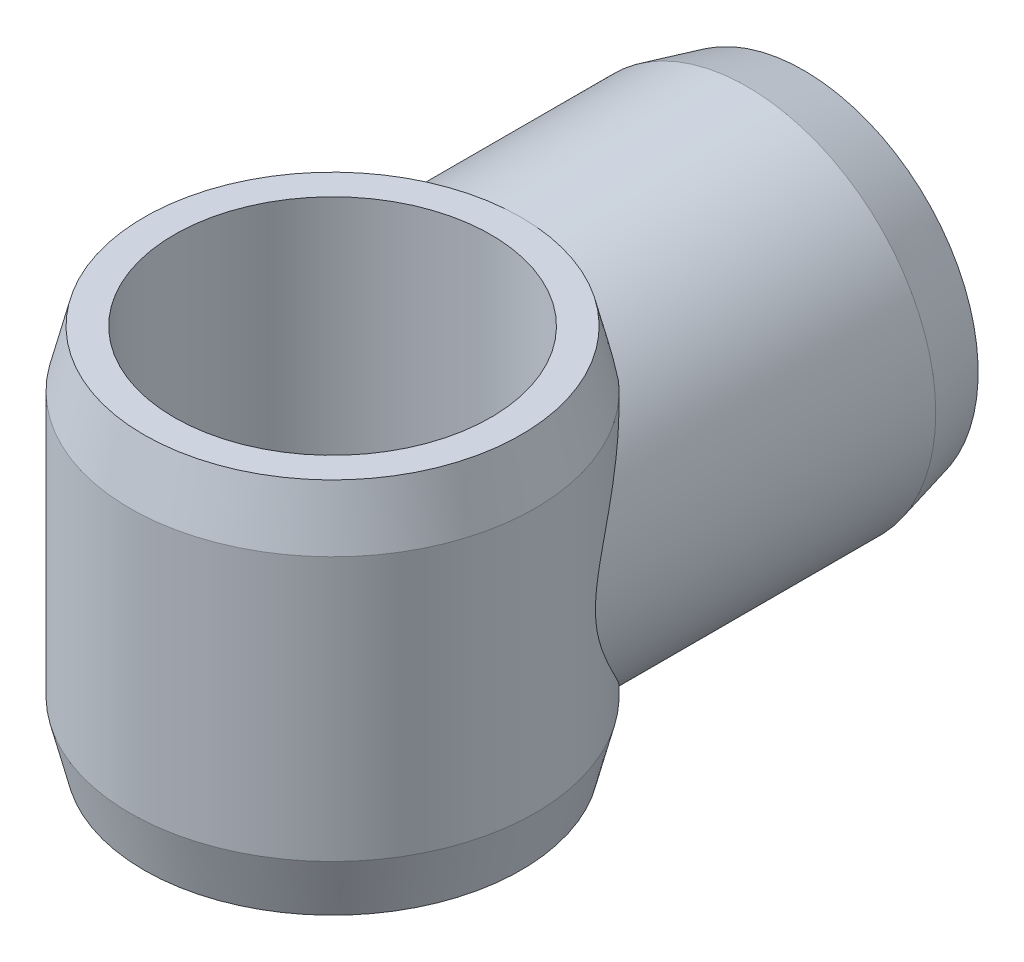
ISO-10303-21;
HEADER;
FILE_DESCRIPTION(('STEP AP214'),'2;1');
FILE_NAME('part.step','',(''),(''),'','','');
FILE_SCHEMA(('AUTOMOTIVE_DESIGN { 1 0 10303 214 1 1 1 1 }'));
ENDSEC;
DATA;
#1=APPLICATION_CONTEXT('core data for automotive mechanical design processes');
#2=APPLICATION_PROTOCOL_DEFINITION('international standard','automotive_design',2000,#1);
#3=PRODUCT_CONTEXT('',#1,'mechanical');
#4=PRODUCT('Part','Part','',(#3));
#5=PRODUCT_RELATED_PRODUCT_CATEGORY('part','',(#4));
#6=PRODUCT_DEFINITION_FORMATION('','',#4);
#7=PRODUCT_DEFINITION_CONTEXT('part definition',#1,'design');
#8=PRODUCT_DEFINITION('design','',#6,#7);
#9=PRODUCT_DEFINITION_SHAPE('','',#8);
#10=(LENGTH_UNIT() NAMED_UNIT(*) SI_UNIT(.MILLI.,.METRE.));
#11=(NAMED_UNIT(*) PLANE_ANGLE_UNIT() SI_UNIT($,.RADIAN.));
#12=(NAMED_UNIT(*) SI_UNIT($,.STERADIAN.) SOLID_ANGLE_UNIT());
#13=UNCERTAINTY_MEASURE_WITH_UNIT(LENGTH_MEASURE(1.E-05),#10,'distance_accuracy_value','');
#14=(GEOMETRIC_REPRESENTATION_CONTEXT(3) GLOBAL_UNCERTAINTY_ASSIGNED_CONTEXT((#13)) GLOBAL_UNIT_ASSIGNED_CONTEXT((#10,
#11,#12)) REPRESENTATION_CONTEXT('',''));
#15=CARTESIAN_POINT('',(0.,0.,0.));
#16=DIRECTION('',(0.,0.,1.));
#17=DIRECTION('',(1.,0.,0.));
#18=AXIS2_PLACEMENT_3D('',#15,#16,#17);
#19=CARTESIAN_POINT('',(0.,25.4,0.));
#20=DIRECTION('',(0.,-1.,0.));
#21=DIRECTION('',(0.,0.,-1.));
#22=AXIS2_PLACEMENT_3D('',#19,#20,#21);
#23=CYLINDRICAL_SURFACE('',#22,13.6525);
#24=CARTESIAN_POINT('',(-5.01006549359588,4.7487958301978,-12.6999999999953));
#25=CARTESIAN_POINT('',(-5.24885199323534,4.8992791694602,-12.605829803232));
#26=CARTESIAN_POINT('',(-5.47947450181361,5.05959839201906,-12.5070410206802));
#27=CARTESIAN_POINT('',(-5.92357781907762,5.39851371768995,-12.3029050310004));
#28=CARTESIAN_POINT('',(-6.13706722338515,5.57710055240605,-12.1975611602349));
#29=CARTESIAN_POINT('',(-6.54782736507222,5.95267705119812,-11.9821095982729));
#30=CARTESIAN_POINT('',(-6.74496829118243,6.14979157020008,-11.871972738598));
#31=CARTESIAN_POINT('',(-7.12072860066184,6.56036738615513,-11.6504734505019));
#32=CARTESIAN_POINT('',(-7.29934534202377,6.77383100736763,-11.5391108497583));
#33=CARTESIAN_POINT('',(-7.63723933399714,7.21617099704601,-11.3183050856353));
#34=CARTESIAN_POINT('',(-7.79653222705364,7.44503466282995,-11.2088604319389));
#35=CARTESIAN_POINT('',(-8.09513529466458,7.91780840010443,-10.9951466026978));
#36=CARTESIAN_POINT('',(-8.23444343792827,8.16171999749934,-10.8908779539561));
#37=CARTESIAN_POINT('',(-8.49150464776284,8.66318365069259,-10.6916540080425));
#38=CARTESIAN_POINT('',(-8.60932657618659,8.92068859268369,-10.5966694270231));
#39=CARTESIAN_POINT('',(-8.82244757209768,9.44917156901811,-10.4199020112688));
#40=CARTESIAN_POINT('',(-8.91775893928788,9.72014214734857,-10.3381119748542));
#41=CARTESIAN_POINT('',(-9.05752471874923,10.1855608405615,-10.2155603588938));
#42=CARTESIAN_POINT('',(-9.10850063724888,10.3768175304103,-10.1700369658767));
#43=CARTESIAN_POINT('',(-9.1985960880708,10.7640950667172,-10.0886212942419));
#44=CARTESIAN_POINT('',(-9.2377191042781,10.9601144949451,-10.0527261859703));
#45=CARTESIAN_POINT('',(-9.30350684455108,11.3556422589091,-9.99187321871044));
#46=CARTESIAN_POINT('',(-9.33018863612351,11.5551454231054,-9.96690037893289));
#47=CARTESIAN_POINT('',(-9.37072269098755,11.956593065493,-9.92880118080943));
#48=CARTESIAN_POINT('',(-9.38457475339085,12.158537581861,-9.91567500795908));
#49=CARTESIAN_POINT('',(-9.3992131070932,12.5640186454323,-9.90180057892744));
#50=CARTESIAN_POINT('',(-9.39995485008133,12.7675582704711,-9.90109452582644));
#51=CARTESIAN_POINT('',(-9.38824444587053,13.1739056854136,-9.9121987957247));
#52=CARTESIAN_POINT('',(-9.37579251078941,13.3767134870303,-9.92400891749853));
#53=CARTESIAN_POINT('',(-9.33791163611287,13.7802421617488,-9.95966031356682));
#54=CARTESIAN_POINT('',(-9.31246950769233,13.9809607018929,-9.98351381512042));
#55=CARTESIAN_POINT('',(-9.24903919179672,14.3787708413489,-10.0423050154206));
#56=CARTESIAN_POINT('',(-9.21104832128694,14.5758616554978,-10.0772450845129));
#57=CARTESIAN_POINT('',(-9.11427159236757,15.0043129905254,-10.1649340510647));
#58=CARTESIAN_POINT('',(-9.05284527714515,15.2346350921119,-10.2198478600754));
#59=CARTESIAN_POINT('',(-8.91377857385275,15.6871439161762,-10.3413644678315));
#60=CARTESIAN_POINT('',(-8.83613431320729,15.9093286806728,-10.4079700577722));
#61=CARTESIAN_POINT('',(-8.66549696650441,16.3450508452897,-10.5504632692385));
#62=CARTESIAN_POINT('',(-8.5724800355521,16.5585741593513,-10.6263652625118));
#63=CARTESIAN_POINT('',(-8.37206887302446,16.9760357442998,-10.7849702232836));
#64=CARTESIAN_POINT('',(-8.26467540967235,17.1799745265588,-10.8676728272942));
#65=CARTESIAN_POINT('',(-7.91725462624004,17.7851643405274,-11.1261866585939));
#66=CARTESIAN_POINT('',(-7.65545661199009,18.1710105562255,-11.3093695025267));
#67=CARTESIAN_POINT('',(-7.07938613679676,18.8983521397315,-11.6786150550954));
#68=CARTESIAN_POINT('',(-6.76519867375624,19.2399177791938,-11.8646726630284));
#69=CARTESIAN_POINT('',(-6.20985990624829,19.7602982493908,-12.1609427694005));
#70=CARTESIAN_POINT('',(-5.98347237547156,19.9532520522998,-12.2742178443135));
#71=CARTESIAN_POINT('',(-5.5112070368571,20.3182630432449,-12.4934096191945));
#72=CARTESIAN_POINT('',(-5.26533140350488,20.4903225572593,-12.599327137652));
#73=CARTESIAN_POINT('',(-5.01006549359588,20.6512041698022,-12.6999999999953));
#74=B_SPLINE_CURVE_WITH_KNOTS('',3,(#24,#25,#26,#27,#28,#29,#30,#31,#32,#33,#34,#35,#36,#37,#38,
#39,#40,#41,#42,#43,#44,#45,#46,#47,#48,#49,#50,#51,#52,#53,#54,#55,#56,#57,#58,#59,#60,#61,#62,
#63,#64,#65,#66,#67,#68,#69,#70,#71,#72,#73),.UNSPECIFIED.,.F.,.F.,(4,2,2,2,2,2,2,2,2,2,2,2,2,2,
2,2,2,2,2,2,2,2,2,2,4),(0.,0.892156097495962,1.78386176813339,2.68207864952074,3.58042346319741,
4.47803615406301,5.37574001557059,6.27051419652274,7.16479833859998,7.77354753842628,
8.38211763660095,8.98985039300644,9.59759266514956,10.2073996243222,10.817196779636,
11.4276142912441,12.0381624002177,12.7709395993384,13.503891973899,14.237992105572,
14.9720530255771,16.4696323118927,17.964805117869,18.9184303819013,19.8719493896704),.UNSPECIFIED.);
#75=CARTESIAN_POINT('',(-5.01006549358389,4.74879583019025,-12.6999999999953));
#76=VERTEX_POINT('',#75);
#77=CARTESIAN_POINT('',(-5.01006549358389,20.6512041698098,-12.6999999999953));
#78=VERTEX_POINT('',#77);
#79=EDGE_CURVE('E63',#76,#78,#74,.T.);
#80=ORIENTED_EDGE('',*,*,#79,.T.);
#81=DIRECTION('',(0.,-1.,0.));
#82=VECTOR('',#81,1.);
#83=CARTESIAN_POINT('',(-5.01006549358389,25.4,-12.7));
#84=LINE('',#83,#82);
#85=EDGE_CURVE('E66',#76,#78,#84,.F.);
#86=ORIENTED_EDGE('',*,*,#85,.F.);
#87=EDGE_LOOP('',(#80,#86));
#88=FACE_BOUND('',#87,.T.);
#89=ADVANCED_FACE('F44',(#88),#23,.T.);
#90=CARTESIAN_POINT('',(5.01006549359588,20.6512041698022,-12.6999999999953));
#91=CARTESIAN_POINT('',(5.24885199323535,20.5007208305398,-12.605829803232));
#92=CARTESIAN_POINT('',(5.47947450181361,20.3404016079809,-12.5070410206802));
#93=CARTESIAN_POINT('',(5.92357781907762,20.0014862823101,-12.3029050310004));
#94=CARTESIAN_POINT('',(6.13706722338515,19.822899447594,-12.1975611602349));
#95=CARTESIAN_POINT('',(6.54782736507222,19.4473229488019,-11.9821095982729));
#96=CARTESIAN_POINT('',(6.74496829118243,19.2502084297999,-11.871972738598));
#97=CARTESIAN_POINT('',(7.12072860066184,18.8396326138449,-11.6504734505019));
#98=CARTESIAN_POINT('',(7.29934534202377,18.6261689926324,-11.5391108497583));
#99=CARTESIAN_POINT('',(7.63723933399714,18.183829002954,-11.3183050856353));
#100=CARTESIAN_POINT('',(7.79653222705364,17.95496533717,-11.2088604319389));
#101=CARTESIAN_POINT('',(8.09513529466458,17.4821915998956,-10.9951466026978));
#102=CARTESIAN_POINT('',(8.23444343792828,17.2382800025007,-10.8908779539561));
#103=CARTESIAN_POINT('',(8.49150464776284,16.7368163493074,-10.6916540080425));
#104=CARTESIAN_POINT('',(8.6093265761866,16.4793114073163,-10.5966694270231));
#105=CARTESIAN_POINT('',(8.82244757209768,15.9508284309819,-10.4199020112688));
#106=CARTESIAN_POINT('',(8.91775893928788,15.6798578526514,-10.3381119748542));
#107=CARTESIAN_POINT('',(9.05752471874923,15.2144391594385,-10.2155603588938));
#108=CARTESIAN_POINT('',(9.10850063724888,15.0231824695897,-10.1700369658766));
#109=CARTESIAN_POINT('',(9.1985960880708,14.6359049332828,-10.0886212942419));
#110=CARTESIAN_POINT('',(9.2377191042781,14.4398855050549,-10.0527261859703));
#111=CARTESIAN_POINT('',(9.30350684455108,14.0443577410909,-9.99187321871045));
#112=CARTESIAN_POINT('',(9.33018863612351,13.8448545768946,-9.96690037893289));
#113=CARTESIAN_POINT('',(9.37072269098755,13.443406934507,-9.92880118080942));
#114=CARTESIAN_POINT('',(9.38457475339085,13.241462418139,-9.91567500795908));
#115=CARTESIAN_POINT('',(9.3992131070932,12.8359813545677,-9.90180057892744));
#116=CARTESIAN_POINT('',(9.39995485008133,12.6324417295289,-9.90109452582643));
#117=CARTESIAN_POINT('',(9.38824444587053,12.2260943145864,-9.9121987957247));
#118=CARTESIAN_POINT('',(9.37579251078941,12.0232865129697,-9.92400891749853));
#119=CARTESIAN_POINT('',(9.33791163611287,11.6197578382512,-9.95966031356682));
#120=CARTESIAN_POINT('',(9.31246950769232,11.4190392981071,-9.98351381512042));
#121=CARTESIAN_POINT('',(9.24903919179672,11.0212291586511,-10.0423050154206));
#122=CARTESIAN_POINT('',(9.21104832128693,10.8241383445022,-10.0772450845129));
#123=CARTESIAN_POINT('',(9.11427159236757,10.3956870094746,-10.1649340510647));
#124=CARTESIAN_POINT('',(9.05284527714515,10.165364907888,-10.2198478600754));
#125=CARTESIAN_POINT('',(8.91377857385274,9.71285608382383,-10.3413644678315));
#126=CARTESIAN_POINT('',(8.83613431320729,9.49067131932715,-10.4079700577722));
#127=CARTESIAN_POINT('',(8.66549696650441,9.05494915471034,-10.5504632692385));
#128=CARTESIAN_POINT('',(8.57248003555209,8.84142584064867,-10.6263652625119));
#129=CARTESIAN_POINT('',(8.37206887302445,8.42396425570014,-10.7849702232836));
#130=CARTESIAN_POINT('',(8.26467540967235,8.22002547344119,-10.8676728272942));
#131=CARTESIAN_POINT('',(7.91725462624003,7.61483565947261,-11.1261866585939));
#132=CARTESIAN_POINT('',(7.65545661199008,7.22898944377452,-11.3093695025267));
#133=CARTESIAN_POINT('',(7.07938613679675,6.50164786026848,-11.6786150550954));
#134=CARTESIAN_POINT('',(6.76519867375623,6.16008222080617,-11.8646726630284));
#135=CARTESIAN_POINT('',(6.20985990624829,5.63970175060923,-12.1609427694005));
#136=CARTESIAN_POINT('',(5.98347237547156,5.4467479477002,-12.2742178443135));
#137=CARTESIAN_POINT('',(5.5112070368571,5.08173695675512,-12.4934096191945));
#138=CARTESIAN_POINT('',(5.26533140350488,4.90967744274068,-12.599327137652));
#139=CARTESIAN_POINT('',(5.01006549359588,4.7487958301978,-12.6999999999953));
#140=B_SPLINE_CURVE_WITH_KNOTS('',3,(#90,#91,#92,#93,#94,#95,#96,#97,#98,#99,#100,#101,#102,
#103,#104,#105,#106,#107,#108,#109,#110,#111,#112,#113,#114,#115,#116,#117,#118,#119,#120,#121,
#122,#123,#124,#125,#126,#127,#128,#129,#130,#131,#132,#133,#134,#135,#136,#137,#138,#139),
.UNSPECIFIED.,.F.,.F.,(4,2,2,2,2,2,2,2,2,2,2,2,2,2,2,2,2,2,2,2,2,2,2,2,4),(0.,0.892156097495961,
1.78386176813339,2.68207864952074,3.58042346319741,4.47803615406301,5.3757400155706,
6.27051419652275,7.16479833859998,7.77354753842628,8.38211763660095,8.98985039300644,
9.59759266514956,10.2073996243222,10.817196779636,11.4276142912441,12.0381624002177,
12.7709395993384,13.503891973899,14.237992105572,14.9720530255771,16.4696323118928,
17.964805117869,18.9184303819013,19.8719493896704),.UNSPECIFIED.);
#141=CARTESIAN_POINT('',(5.01006549358389,20.6512041698098,-12.6999999999953));
#142=VERTEX_POINT('',#141);
#143=CARTESIAN_POINT('',(5.01006549358389,4.74879583019025,-12.6999999999953));
#144=VERTEX_POINT('',#143);
#145=EDGE_CURVE('E185',#142,#144,#140,.T.);
#146=ORIENTED_EDGE('',*,*,#145,.T.);
#147=DIRECTION('',(0.,-1.,0.));
#148=VECTOR('',#147,1.);
#149=CARTESIAN_POINT('',(5.01006549358389,25.4,-12.7));
#150=LINE('',#149,#148);
#151=EDGE_CURVE('E176',#142,#144,#150,.T.);
#152=ORIENTED_EDGE('',*,*,#151,.F.);
#153=EDGE_LOOP('',(#146,#152));
#154=FACE_BOUND('',#153,.T.);
#155=ADVANCED_FACE('F46',(#154),#23,.T.);
#156=CARTESIAN_POINT('',(0.,12.7,500000.));
#157=DIRECTION('',(0.,0.,-1.));
#158=DIRECTION('',(-1.,0.,0.));
#159=AXIS2_PLACEMENT_3D('',#156,#157,#158);
#160=CYLINDRICAL_SURFACE('',#159,12.7);
#161=CARTESIAN_POINT('',(9.06961410424942,3.81,-10.2045507617925));
#162=CARTESIAN_POINT('',(9.2293478116452,3.97298093650903,-10.062585453037));
#163=CARTESIAN_POINT('',(9.38380381091571,4.1393247823001,-9.91859226235884));
#164=CARTESIAN_POINT('',(9.68228522227931,4.4784152695319,-9.62743736068499));
#165=CARTESIAN_POINT('',(9.82631220115903,4.65116094328481,-9.48027612996207));
#166=CARTESIAN_POINT('',(10.1043376377466,5.00307146442112,-9.18338433944754));
#167=CARTESIAN_POINT('',(10.2383191525511,5.18224643521794,-9.03364994016951));
#168=CARTESIAN_POINT('',(10.4961354502637,5.54661208472218,-8.7327626783487));
#169=CARTESIAN_POINT('',(10.6199699219714,5.73180294768834,-8.58160977245998));
#170=CARTESIAN_POINT('',(10.8589263100322,6.11028339058769,-8.27721717710624));
#171=CARTESIAN_POINT('',(10.9739361179237,6.30364009808886,-8.12397296357276));
#172=CARTESIAN_POINT('',(11.1937783683698,6.69666496779323,-7.81828093803262));
#173=CARTESIAN_POINT('',(11.2986109586318,6.8963330383405,-7.66583311449793));
#174=CARTESIAN_POINT('',(11.4980138650766,7.30215381882273,-7.36336918279845));
#175=CARTESIAN_POINT('',(11.5925946981217,7.50829959797344,-7.21335071949049));
#176=CARTESIAN_POINT('',(11.7715216474149,7.92786241625003,-6.91750532157284));
#177=CARTESIAN_POINT('',(11.8558703645903,8.14127758980979,-6.77167732899949));
#178=CARTESIAN_POINT('',(11.9907069800341,8.51198257965089,-6.52892713749255));
#179=CARTESIAN_POINT('',(12.0438299787696,8.66719825915444,-6.43029964511386));
#180=CARTESIAN_POINT('',(12.1447433434792,8.98212946913938,-6.23761043203769));
#181=CARTESIAN_POINT('',(12.1925341609901,9.14184461716246,-6.14354832511846));
#182=CARTESIAN_POINT('',(12.2825450379461,9.46621175623357,-5.96155486384697));
#183=CARTESIAN_POINT('',(12.3247675794314,9.63086150725823,-5.87362078624527));
#184=CARTESIAN_POINT('',(12.4033223632629,9.96555616868532,-5.70586939393166));
#185=CARTESIAN_POINT('',(12.4396550493415,10.1356006715005,-5.62605146793075));
#186=CARTESIAN_POINT('',(12.5285577296923,10.5993646934798,-5.42629538905201));
#187=CARTESIAN_POINT('',(12.5753968528595,10.8986453896415,-5.31592555093723));
#188=CARTESIAN_POINT('',(12.6299012195096,11.3585970787951,-5.18446191317588));
#189=CARTESIAN_POINT('',(12.6454327783875,11.5135267984784,-5.14635235777203));
#190=CARTESIAN_POINT('',(12.6708932109357,11.8264638681922,-5.0833428226679));
#191=CARTESIAN_POINT('',(12.6808257923732,11.984469109643,-5.05843410173732));
#192=CARTESIAN_POINT('',(12.694865738256,12.3045476632577,-5.02309875790924));
#193=CARTESIAN_POINT('',(12.6988924288388,12.4666470904534,-5.01287273811133));
#194=CARTESIAN_POINT('',(12.7007092457381,12.7911039267681,-5.00826790419075));
#195=CARTESIAN_POINT('',(12.6984996502761,12.9534613240554,-5.01388838310309));
#196=CARTESIAN_POINT('',(12.6879207212421,13.2769968982214,-5.04059746599792));
#197=CARTESIAN_POINT('',(12.6795391040304,13.4381720752531,-5.06171691595283));
#198=CARTESIAN_POINT('',(12.6569008672564,13.7576034103171,-5.11805884837174));
#199=CARTESIAN_POINT('',(12.6426427769268,13.9158588272232,-5.15328486137203));
#200=CARTESIAN_POINT('',(12.6043566025352,14.268132814909,-5.24633867826718));
#201=CARTESIAN_POINT('',(12.5787687485133,14.4610591321856,-5.30763108893267));
#202=CARTESIAN_POINT('',(12.5198356059838,14.8402303344482,-5.44518642380977));
#203=CARTESIAN_POINT('',(12.4864870216407,15.0264723418388,-5.52145570626044));
#204=CARTESIAN_POINT('',(12.4125935850252,15.3930680193782,-5.68563178527082));
#205=CARTESIAN_POINT('',(12.3720223913834,15.5733971733371,-5.7735808701059));
#206=CARTESIAN_POINT('',(12.2842674347891,15.9280265967863,-5.95801736031369));
#207=CARTESIAN_POINT('',(12.2370807470431,16.1023241569037,-6.05450853525999));
#208=CARTESIAN_POINT('',(12.1335200463432,16.4554637043987,-6.25958435934204));
#209=CARTESIAN_POINT('',(12.0767699911729,16.6339747554412,-6.36854627474909));
#210=CARTESIAN_POINT('',(11.9565599868534,16.9854565009629,-6.59147205734208));
#211=CARTESIAN_POINT('',(11.8931008624801,17.1584278730611,-6.70543530868614));
#212=CARTESIAN_POINT('',(11.6927690544088,17.6702833784598,-7.05274192203747));
#213=CARTESIAN_POINT('',(11.5460327782391,18.0018033549283,-7.29131789122901));
#214=CARTESIAN_POINT('',(11.2269764646006,18.6476433157563,-7.77364392895924));
#215=CARTESIAN_POINT('',(11.0546794692024,18.9619784459421,-8.01738916970824));
#216=CARTESIAN_POINT('',(10.6843181074507,19.5748394514156,-8.50468725532969));
#217=CARTESIAN_POINT('',(10.4862717819561,19.8733761914503,-8.74824011590373));
#218=CARTESIAN_POINT('',(10.0935872138064,20.4139333644126,-9.19707836451413));
#219=CARTESIAN_POINT('',(9.90239671543234,20.6579921704366,-9.40292265118799));
#220=CARTESIAN_POINT('',(9.60100040596399,21.0147426175782,-9.70731075193863));
#221=CARTESIAN_POINT('',(9.49822250765223,21.1319776818081,-9.8079340327068));
#222=CARTESIAN_POINT('',(9.28767513455375,21.3633447712597,-10.0075416057304));
#223=CARTESIAN_POINT('',(9.17990520960698,21.4774765151586,-10.1065257490784));
#224=CARTESIAN_POINT('',(9.06961410424942,21.59,-10.2045507617925));
#225=B_SPLINE_CURVE_WITH_KNOTS('',3,(#161,#162,#163,#164,#165,#166,#167,#168,#169,#170,#171,
#172,#173,#174,#175,#176,#177,#178,#179,#180,#181,#182,#183,#184,#185,#186,#187,#188,#189,#190,
#191,#192,#193,#194,#195,#196,#197,#198,#199,#200,#201,#202,#203,#204,#205,#206,#207,#208,#209,
#210,#211,#212,#213,#214,#215,#216,#217,#218,#219,#220,#221,#222,#223,#224),.UNSPECIFIED.,.F.,
.F.,(4,2,2,2,2,2,2,2,2,2,2,2,2,2,2,2,2,2,2,2,2,2,2,2,2,2,2,2,2,2,2,4),(0.,0.806160611949841,
1.61219985932905,2.41956935769561,3.22696360807037,4.0433298975813,4.8596843369619,
5.67519322309145,6.49049437665319,7.06459814041934,7.63865325128836,8.21245160786049,
8.78620671526058,9.74963070981129,10.2299913790807,10.7100335680072,11.1965739108763,
11.6830925479065,12.1705820867307,12.6581937088879,13.2692871750356,13.8806406361611,
14.4942712132602,15.1081739447562,15.7580014303512,16.4077491224214,17.7083454625562,
19.0077764070618,20.3063017832036,21.4219599412471,21.9785499558517,22.5351902594956),.UNSPECIFIED.);
#226=CARTESIAN_POINT('',(9.06961410424942,3.81,-10.2045507617925));
#227=VERTEX_POINT('',#226);
#228=CARTESIAN_POINT('',(9.06961410424942,21.59,-10.2045507617925));
#229=VERTEX_POINT('',#228);
#230=EDGE_CURVE('E114',#227,#229,#225,.T.);
#231=ORIENTED_EDGE('',*,*,#230,.F.);
#232=CARTESIAN_POINT('',(9.06981013913742,3.8102,-10.2044434214954));
#233=CARTESIAN_POINT('',(8.9454572365505,3.68333725916583,-10.2725406655435));
#234=CARTESIAN_POINT('',(8.81856193822948,3.5591891051591,-10.3409906852779));
#235=CARTESIAN_POINT('',(8.55969965119397,3.31633994059866,-10.4779862166823));
#236=CARTESIAN_POINT('',(8.42773244487381,3.19763916424026,-10.5465317323277));
#237=CARTESIAN_POINT('',(8.02402246274993,2.84954693331299,-10.7515075773948));
#238=CARTESIAN_POINT('',(7.74469006976697,2.62838876969123,-10.8871552913005));
#239=CARTESIAN_POINT('',(7.16440338325036,2.20759074854825,-11.1527527433476));
#240=CARTESIAN_POINT('',(6.86331467798348,2.00810785367587,-11.2826573362345));
#241=CARTESIAN_POINT('',(6.24200851363601,1.63389352120681,-11.5316568658226));
#242=CARTESIAN_POINT('',(5.92180028682838,1.45915027277671,-11.6507569508286));
#243=CARTESIAN_POINT('',(5.32268109704083,1.16529287806681,-11.8542721026637));
#244=CARTESIAN_POINT('',(5.04670926993833,1.04182696783844,-11.9410718628128));
#245=CARTESIAN_POINT('',(4.48366029800947,0.813915645252459,-12.1029549084867));
#246=CARTESIAN_POINT('',(4.19658364210256,0.709469396656955,-12.1780387091065));
#247=CARTESIAN_POINT('',(3.61355178052994,0.521091521207379,-12.3145020258963));
#248=CARTESIAN_POINT('',(3.31762497317991,0.437100834652449,-12.3759209500767));
#249=CARTESIAN_POINT('',(2.71784825382939,0.290382817663216,-12.4837890711567));
#250=CARTESIAN_POINT('',(2.41399840944368,0.227655305834006,-12.5302383957609));
#251=CARTESIAN_POINT('',(1.79853775778601,0.124100387416906,-12.6071754197559));
#252=CARTESIAN_POINT('',(1.48688966678832,0.0834160587050651,-12.6375588084866));
#253=CARTESIAN_POINT('',(0.86022294985076,0.0252600857758255,-12.68105070223));
#254=CARTESIAN_POINT('',(0.545204296940492,0.0077886274423087,-12.6941590689078));
#255=CARTESIAN_POINT('',(-0.0856503792673875,-0.00363100810224807,-12.7027228867718));
#256=CARTESIAN_POINT('',(-0.401486721208014,0.00243205900837769,-12.69816989972));
#257=CARTESIAN_POINT('',(-1.03107412430588,0.0379983581898436,-12.6715233953758));
#258=CARTESIAN_POINT('',(-1.34482530107542,0.0675002795702952,-12.6494308588872));
#259=CARTESIAN_POINT('',(-1.94010154935249,0.145796510041629,-12.5910470069131));
#260=CARTESIAN_POINT('',(-2.22202534167613,0.192656685435288,-12.5561821344724));
#261=CARTESIAN_POINT('',(-2.78017835338786,0.304774005480672,-12.4732164359945));
#262=CARTESIAN_POINT('',(-3.05640794787836,0.37002993413874,-12.4251164848257));
#263=CARTESIAN_POINT('',(-3.6016780166623,0.51813840655668,-12.3167292812085));
#264=CARTESIAN_POINT('',(-3.87071758944142,0.600993145381527,-12.2564405085177));
#265=CARTESIAN_POINT('',(-4.40031993569886,0.783388223007094,-12.1249327838814));
#266=CARTESIAN_POINT('',(-4.66088235077176,0.882929266195583,-12.0537133705257));
#267=CARTESIAN_POINT('',(-5.19123751576803,1.10561743246259,-11.8961884630819));
#268=CARTESIAN_POINT('',(-5.46031392221183,1.22995785498863,-11.8091609499859));
#269=CARTESIAN_POINT('',(-5.98669283005258,1.49569460377877,-11.6259867235045));
#270=CARTESIAN_POINT('',(-6.24399371800646,1.63709325771264,-11.5298387659783));
#271=CARTESIAN_POINT('',(-6.74616407834498,1.93595550247496,-11.3304201350169));
#272=CARTESIAN_POINT('',(-6.99103394624262,2.09341858170743,-11.2271496884422));
#273=CARTESIAN_POINT('',(-7.46789399181772,2.42358826862899,-11.0156154119641));
#274=CARTESIAN_POINT('',(-7.69988710947853,2.59629137324334,-10.9073527322938));
#275=CARTESIAN_POINT('',(-8.1268515167261,2.93727283762234,-10.6997080119669));
#276=CARTESIAN_POINT('',(-8.32313915397664,3.1040763148843,-10.6006025555601));
#277=CARTESIAN_POINT('',(-8.70465396673386,3.44879492524537,-10.4022420934081));
#278=CARTESIAN_POINT('',(-8.88990623757419,3.62668280493336,-10.3029879978169));
#279=CARTESIAN_POINT('',(-9.06981013913742,3.8102,-10.2044434214954));
#280=B_SPLINE_CURVE_WITH_KNOTS('',3,(#232,#233,#234,#235,#236,#237,#238,#239,#240,#241,#242,
#243,#244,#245,#246,#247,#248,#249,#250,#251,#252,#253,#254,#255,#256,#257,#258,#259,#260,#261,
#262,#263,#264,#265,#266,#267,#268,#269,#270,#271,#272,#273,#274,#275,#276,#277,#278,#279),
.UNSPECIFIED.,.F.,.F.,(4,2,2,2,2,2,2,2,2,2,2,2,2,2,2,2,2,2,2,2,2,2,2,4),(0.,0.570669562982798,
1.14136363742439,2.28375537278061,3.4339345507868,4.58356276229527,5.52629058362634,
6.4689769460091,7.40890841193516,8.34883185915876,9.2947852185007,10.2407461527965,
11.1871591037688,12.133519135471,12.9962926879557,13.8590092228644,14.7218334259633,
15.5846940610918,16.510592038355,17.4366165016291,18.3626114834495,19.2883941676013,
20.1159457694486,20.941537334698),.UNSPECIFIED.);
#281=CARTESIAN_POINT('',(0.,0.,-12.7));
#282=VERTEX_POINT('',#281);
#283=EDGE_CURVE('E99',#227,#282,#280,.T.);
#284=ORIENTED_EDGE('',*,*,#283,.T.);
#285=CARTESIAN_POINT('',(-9.06961410424942,3.81,-10.2045507617925));
#286=VERTEX_POINT('',#285);
#287=EDGE_CURVE('E92',#282,#286,#280,.T.);
#288=ORIENTED_EDGE('',*,*,#287,.T.);
#289=CARTESIAN_POINT('',(-9.06961410424942,21.59,-10.2045507617925));
#290=CARTESIAN_POINT('',(-9.2293478116452,21.427019063491,-10.062585453037));
#291=CARTESIAN_POINT('',(-9.38380381091571,21.2606752176999,-9.91859226235884));
#292=CARTESIAN_POINT('',(-9.68228522227931,20.9215847304681,-9.62743736068499));
#293=CARTESIAN_POINT('',(-9.82631220115903,20.7488390567152,-9.48027612996207));
#294=CARTESIAN_POINT('',(-10.1043376377466,20.3969285355789,-9.18338433944754));
#295=CARTESIAN_POINT('',(-10.2383191525511,20.2177535647821,-9.03364994016951));
#296=CARTESIAN_POINT('',(-10.4961354502637,19.8533879152778,-8.7327626783487));
#297=CARTESIAN_POINT('',(-10.6199699219714,19.6681970523117,-8.58160977245997));
#298=CARTESIAN_POINT('',(-10.8589263100322,19.2897166094123,-8.27721717710624));
#299=CARTESIAN_POINT('',(-10.9739361179237,19.0963599019111,-8.12397296357276));
#300=CARTESIAN_POINT('',(-11.1937783683698,18.7033350322068,-7.81828093803262));
#301=CARTESIAN_POINT('',(-11.2986109586318,18.5036669616595,-7.66583311449793));
#302=CARTESIAN_POINT('',(-11.4980138650766,18.0978461811773,-7.36336918279845));
#303=CARTESIAN_POINT('',(-11.5925946981217,17.8917004020266,-7.21335071949049));
#304=CARTESIAN_POINT('',(-11.7715216474149,17.47213758375,-6.91750532157284));
#305=CARTESIAN_POINT('',(-11.8558703645903,17.2587224101902,-6.77167732899949));
#306=CARTESIAN_POINT('',(-11.9907069800341,16.8880174203491,-6.52892713749256));
#307=CARTESIAN_POINT('',(-12.0438299787696,16.7328017408456,-6.43029964511386));
#308=CARTESIAN_POINT('',(-12.1447433434792,16.4178705308606,-6.23761043203769));
#309=CARTESIAN_POINT('',(-12.1925341609901,16.2581553828376,-6.14354832511846));
#310=CARTESIAN_POINT('',(-12.2825450379461,15.9337882437664,-5.96155486384697));
#311=CARTESIAN_POINT('',(-12.3247675794314,15.7691384927418,-5.87362078624526));
#312=CARTESIAN_POINT('',(-12.4033223632629,15.4344438313147,-5.70586939393166));
#313=CARTESIAN_POINT('',(-12.4396550493415,15.2643993284995,-5.62605146793075));
#314=CARTESIAN_POINT('',(-12.5285577296923,14.8006353065202,-5.42629538905201));
#315=CARTESIAN_POINT('',(-12.5753968528595,14.5013546103585,-5.31592555093722));
#316=CARTESIAN_POINT('',(-12.6299012195096,14.0414029212049,-5.18446191317588));
#317=CARTESIAN_POINT('',(-12.6454327783875,13.8864732015216,-5.14635235777203));
#318=CARTESIAN_POINT('',(-12.6708932109357,13.5735361318078,-5.08334282266791));
#319=CARTESIAN_POINT('',(-12.6808257923732,13.415530890357,-5.05843410173732));
#320=CARTESIAN_POINT('',(-12.694865738256,13.0954523367423,-5.02309875790924));
#321=CARTESIAN_POINT('',(-12.6988924288388,12.9333529095466,-5.01287273811132));
#322=CARTESIAN_POINT('',(-12.7007092457381,12.6088960732319,-5.00826790419075));
#323=CARTESIAN_POINT('',(-12.6984996502761,12.4465386759446,-5.01388838310309));
#324=CARTESIAN_POINT('',(-12.6879207212421,12.1230031017786,-5.04059746599792));
#325=CARTESIAN_POINT('',(-12.6795391040304,11.9618279247469,-5.06171691595283));
#326=CARTESIAN_POINT('',(-12.6569008672564,11.6423965896829,-5.11805884837174));
#327=CARTESIAN_POINT('',(-12.6426427769268,11.4841411727768,-5.15328486137203));
#328=CARTESIAN_POINT('',(-12.6043566025352,11.131867185091,-5.24633867826718));
#329=CARTESIAN_POINT('',(-12.5787687485133,10.9389408678144,-5.30763108893267));
#330=CARTESIAN_POINT('',(-12.5198356059838,10.5597696655518,-5.44518642380977));
#331=CARTESIAN_POINT('',(-12.4864870216407,10.3735276581612,-5.52145570626044));
#332=CARTESIAN_POINT('',(-12.4125935850252,10.0069319806218,-5.68563178527081));
#333=CARTESIAN_POINT('',(-12.3720223913834,9.82660282666289,-5.7735808701059));
#334=CARTESIAN_POINT('',(-12.2842674347891,9.47197340321374,-5.95801736031369));
#335=CARTESIAN_POINT('',(-12.2370807470431,9.29767584309625,-6.05450853525999));
#336=CARTESIAN_POINT('',(-12.1335200463432,8.94453629560134,-6.25958435934204));
#337=CARTESIAN_POINT('',(-12.0767699911729,8.76602524455878,-6.36854627474909));
#338=CARTESIAN_POINT('',(-11.9565599868534,8.41454349903714,-6.59147205734208));
#339=CARTESIAN_POINT('',(-11.8931008624801,8.24157212693895,-6.70543530868614));
#340=CARTESIAN_POINT('',(-11.6927690544088,7.72971662154015,-7.05274192203747));
#341=CARTESIAN_POINT('',(-11.5460327782391,7.39819664507172,-7.29131789122901));
#342=CARTESIAN_POINT('',(-11.2269764646006,6.75235668424368,-7.77364392895924));
#343=CARTESIAN_POINT('',(-11.0546794692024,6.4380215540579,-8.01738916970824));
#344=CARTESIAN_POINT('',(-10.6843181074507,5.82516054858436,-8.50468725532969));
#345=CARTESIAN_POINT('',(-10.4862717819561,5.52662380854975,-8.74824011590373));
#346=CARTESIAN_POINT('',(-10.0935872138064,4.9860666355874,-9.19707836451413));
#347=CARTESIAN_POINT('',(-9.90239671543234,4.74200782956339,-9.40292265118799));
#348=CARTESIAN_POINT('',(-9.60100040596398,4.38525738242176,-9.70731075193863));
#349=CARTESIAN_POINT('',(-9.49822250765223,4.26802231819192,-9.8079340327068));
#350=CARTESIAN_POINT('',(-9.28767513455375,4.03665522874028,-10.0075416057304));
#351=CARTESIAN_POINT('',(-9.17990520960698,3.92252348484141,-10.1065257490784));
#352=CARTESIAN_POINT('',(-9.06961410424942,3.81,-10.2045507617925));
#353=B_SPLINE_CURVE_WITH_KNOTS('',3,(#289,#290,#291,#292,#293,#294,#295,#296,#297,#298,#299,
#300,#301,#302,#303,#304,#305,#306,#307,#308,#309,#310,#311,#312,#313,#314,#315,#316,#317,#318,
#319,#320,#321,#322,#323,#324,#325,#326,#327,#328,#329,#330,#331,#332,#333,#334,#335,#336,#337,
#338,#339,#340,#341,#342,#343,#344,#345,#346,#347,#348,#349,#350,#351,#352),.UNSPECIFIED.,.F.,
.F.,(4,2,2,2,2,2,2,2,2,2,2,2,2,2,2,2,2,2,2,2,2,2,2,2,2,2,2,2,2,2,2,4),(0.,0.806160611949843,
1.61219985932905,2.41956935769561,3.22696360807037,4.0433298975813,4.8596843369619,
5.67519322309145,6.49049437665319,7.06459814041934,7.63865325128836,8.21245160786049,
8.78620671526058,9.74963070981129,10.2299913790807,10.7100335680072,11.1965739108763,
11.6830925479065,12.1705820867307,12.6581937088879,13.2692871750356,13.8806406361611,
14.4942712132602,15.1081739447562,15.7580014303512,16.4077491224214,17.7083454625562,
19.0077764070618,20.3063017832036,21.4219599412471,21.9785499558517,22.5351902594956),.UNSPECIFIED.);
#354=CARTESIAN_POINT('',(-9.06961410424942,21.59,-10.2045507617925));
#355=VERTEX_POINT('',#354);
#356=EDGE_CURVE('E96',#355,#286,#353,.T.);
#357=ORIENTED_EDGE('',*,*,#356,.F.);
#358=CARTESIAN_POINT('',(-9.06981013913742,21.5898,-10.2044434214954));
#359=CARTESIAN_POINT('',(-8.9454572365505,21.7166627408342,-10.2725406655435));
#360=CARTESIAN_POINT('',(-8.81856193822948,21.8408108948409,-10.3409906852779));
#361=CARTESIAN_POINT('',(-8.55969965119397,22.0836600594013,-10.4779862166823));
#362=CARTESIAN_POINT('',(-8.42773244487381,22.2023608357597,-10.5465317323277));
#363=CARTESIAN_POINT('',(-8.02402246274993,22.550453066687,-10.7515075773948));
#364=CARTESIAN_POINT('',(-7.74469006976697,22.7716112303088,-10.8871552913005));
#365=CARTESIAN_POINT('',(-7.16440338325036,23.1924092514518,-11.1527527433476));
#366=CARTESIAN_POINT('',(-6.86331467798348,23.3918921463241,-11.2826573362345));
#367=CARTESIAN_POINT('',(-6.242008513636,23.7661064787932,-11.5316568658226));
#368=CARTESIAN_POINT('',(-5.92180028682837,23.9408497272233,-11.6507569508286));
#369=CARTESIAN_POINT('',(-5.32268109704083,24.2347071219332,-11.8542721026637));
#370=CARTESIAN_POINT('',(-5.04670926993833,24.3581730321616,-11.9410718628128));
#371=CARTESIAN_POINT('',(-4.48366029800947,24.5860843547475,-12.1029549084867));
#372=CARTESIAN_POINT('',(-4.19658364210256,24.690530603343,-12.1780387091065));
#373=CARTESIAN_POINT('',(-3.61355178052994,24.8789084787926,-12.3145020258963));
#374=CARTESIAN_POINT('',(-3.31762497317991,24.9628991653476,-12.3759209500767));
#375=CARTESIAN_POINT('',(-2.71784825382939,25.1096171823368,-12.4837890711567));
#376=CARTESIAN_POINT('',(-2.41399840944368,25.172344694166,-12.5302383957609));
#377=CARTESIAN_POINT('',(-1.798537757786,25.2758996125831,-12.6071754197559));
#378=CARTESIAN_POINT('',(-1.48688966678831,25.3165839412949,-12.6375588084866));
#379=CARTESIAN_POINT('',(-0.860222949850757,25.3747399142242,-12.68105070223));
#380=CARTESIAN_POINT('',(-0.545204296940489,25.3922113725577,-12.6941590689078));
#381=CARTESIAN_POINT('',(0.0856503792673905,25.4036310081022,-12.7027228867718));
#382=CARTESIAN_POINT('',(0.401486721208017,25.3975679409916,-12.69816989972));
#383=CARTESIAN_POINT('',(1.03107412430588,25.3620016418102,-12.6715233953758));
#384=CARTESIAN_POINT('',(1.34482530107542,25.3324997204297,-12.6494308588872));
#385=CARTESIAN_POINT('',(1.94010154935249,25.2542034899584,-12.5910470069131));
#386=CARTESIAN_POINT('',(2.22202534167613,25.2073433145647,-12.5561821344724));
#387=CARTESIAN_POINT('',(2.78017835338787,25.0952259945193,-12.4732164359945));
#388=CARTESIAN_POINT('',(3.05640794787837,25.0299700658613,-12.4251164848257));
#389=CARTESIAN_POINT('',(3.6016780166623,24.8818615934433,-12.3167292812085));
#390=CARTESIAN_POINT('',(3.87071758944142,24.7990068546185,-12.2564405085177));
#391=CARTESIAN_POINT('',(4.40031993569887,24.6166117769929,-12.1249327838814));
#392=CARTESIAN_POINT('',(4.66088235077176,24.5170707338044,-12.0537133705257));
#393=CARTESIAN_POINT('',(5.19123751576804,24.2943825675374,-11.8961884630818));
#394=CARTESIAN_POINT('',(5.46031392221183,24.1700421450114,-11.8091609499859));
#395=CARTESIAN_POINT('',(5.98669283005259,23.9043053962212,-11.6259867235045));
#396=CARTESIAN_POINT('',(6.24399371800646,23.7629067422874,-11.5298387659783));
#397=CARTESIAN_POINT('',(6.74616407834498,23.464044497525,-11.3304201350169));
#398=CARTESIAN_POINT('',(6.99103394624262,23.3065814182926,-11.2271496884422));
#399=CARTESIAN_POINT('',(7.46789399181772,22.976411731371,-11.0156154119641));
#400=CARTESIAN_POINT('',(7.69988710947853,22.8037086267567,-10.9073527322938));
#401=CARTESIAN_POINT('',(8.1268515167261,22.4627271623777,-10.6997080119669));
#402=CARTESIAN_POINT('',(8.32313915397664,22.2959236851157,-10.6006025555601));
#403=CARTESIAN_POINT('',(8.70465396673387,21.9512050747546,-10.4022420934081));
#404=CARTESIAN_POINT('',(8.88990623757419,21.7733171950666,-10.3029879978169));
#405=CARTESIAN_POINT('',(9.06981013913742,21.5898,-10.2044434214954));
#406=B_SPLINE_CURVE_WITH_KNOTS('',3,(#358,#359,#360,#361,#362,#363,#364,#365,#366,#367,#368,
#369,#370,#371,#372,#373,#374,#375,#376,#377,#378,#379,#380,#381,#382,#383,#384,#385,#386,#387,
#388,#389,#390,#391,#392,#393,#394,#395,#396,#397,#398,#399,#400,#401,#402,#403,#404,#405),
.UNSPECIFIED.,.F.,.F.,(4,2,2,2,2,2,2,2,2,2,2,2,2,2,2,2,2,2,2,2,2,2,2,4),(0.,0.570669562982795,
1.14136363742439,2.28375537278061,3.43393455078681,4.58356276229528,5.52629058362634,
6.4689769460091,7.40890841193516,8.34883185915876,9.2947852185007,10.2407461527965,
11.1871591037688,12.133519135471,12.9962926879557,13.8590092228644,14.7218334259633,
15.5846940610918,16.510592038355,17.4366165016291,18.3626114834495,19.2883941676013,
20.1159457694486,20.941537334698),.UNSPECIFIED.);
#407=CARTESIAN_POINT('',(0.,25.4,-12.7));
#408=VERTEX_POINT('',#407);
#409=EDGE_CURVE('E104',#355,#408,#406,.T.);
#410=ORIENTED_EDGE('',*,*,#409,.T.);
#411=CARTESIAN_POINT('',(9.06981013913742,21.5898,-10.2044434214954));
#412=CARTESIAN_POINT('',(8.9454572365505,21.7166627408342,-10.2725406655435));
#413=CARTESIAN_POINT('',(8.81856193822948,21.8408108948409,-10.3409906852779));
#414=CARTESIAN_POINT('',(8.55969965119397,22.0836600594013,-10.4779862166823));
#415=CARTESIAN_POINT('',(8.42773244487382,22.2023608357597,-10.5465317323277));
#416=CARTESIAN_POINT('',(8.02402246274993,22.550453066687,-10.7515075773948));
#417=CARTESIAN_POINT('',(7.74469006976697,22.7716112303088,-10.8871552913005));
#418=CARTESIAN_POINT('',(7.16440338325036,23.1924092514517,-11.1527527433476));
#419=CARTESIAN_POINT('',(6.86331467798348,23.3918921463241,-11.2826573362345));
#420=CARTESIAN_POINT('',(6.24200851363601,23.7661064787932,-11.5316568658226));
#421=CARTESIAN_POINT('',(5.92180028682838,23.9408497272233,-11.6507569508286));
#422=CARTESIAN_POINT('',(5.32268109704083,24.2347071219332,-11.8542721026637));
#423=CARTESIAN_POINT('',(5.04670926993833,24.3581730321616,-11.9410718628128));
#424=CARTESIAN_POINT('',(4.48366029800947,24.5860843547475,-12.1029549084867));
#425=CARTESIAN_POINT('',(4.19658364210256,24.690530603343,-12.1780387091065));
#426=CARTESIAN_POINT('',(3.61355178052994,24.8789084787926,-12.3145020258963));
#427=CARTESIAN_POINT('',(3.31762497317991,24.9628991653476,-12.3759209500767));
#428=CARTESIAN_POINT('',(2.71784825382939,25.1096171823368,-12.4837890711567));
#429=CARTESIAN_POINT('',(2.41399840944368,25.172344694166,-12.5302383957609));
#430=CARTESIAN_POINT('',(1.79853775778601,25.2758996125831,-12.6071754197559));
#431=CARTESIAN_POINT('',(1.48688966678831,25.3165839412949,-12.6375588084866));
#432=CARTESIAN_POINT('',(0.860222949850757,25.3747399142242,-12.68105070223));
#433=CARTESIAN_POINT('',(0.545204296940491,25.3922113725577,-12.6941590689078));
#434=CARTESIAN_POINT('',(-0.0856503792673877,25.4036310081022,-12.7027228867718));
#435=CARTESIAN_POINT('',(-0.401486721208013,25.3975679409916,-12.69816989972));
#436=CARTESIAN_POINT('',(-1.03107412430588,25.3620016418102,-12.6715233953758));
#437=CARTESIAN_POINT('',(-1.34482530107542,25.3324997204297,-12.6494308588872));
#438=CARTESIAN_POINT('',(-1.94010154935249,25.2542034899584,-12.5910470069131));
#439=CARTESIAN_POINT('',(-2.22202534167613,25.2073433145647,-12.5561821344724));
#440=CARTESIAN_POINT('',(-2.78017835338786,25.0952259945193,-12.4732164359945));
#441=CARTESIAN_POINT('',(-3.05640794787836,25.0299700658613,-12.4251164848257));
#442=CARTESIAN_POINT('',(-3.6016780166623,24.8818615934433,-12.3167292812085));
#443=CARTESIAN_POINT('',(-3.87071758944142,24.7990068546185,-12.2564405085177));
#444=CARTESIAN_POINT('',(-4.40031993569886,24.6166117769929,-12.1249327838814));
#445=CARTESIAN_POINT('',(-4.66088235077176,24.5170707338044,-12.0537133705257));
#446=CARTESIAN_POINT('',(-5.19123751576803,24.2943825675374,-11.8961884630819));
#447=CARTESIAN_POINT('',(-5.46031392221183,24.1700421450114,-11.8091609499859));
#448=CARTESIAN_POINT('',(-5.98669283005258,23.9043053962212,-11.6259867235045));
#449=CARTESIAN_POINT('',(-6.24399371800646,23.7629067422874,-11.5298387659783));
#450=CARTESIAN_POINT('',(-6.74616407834498,23.464044497525,-11.3304201350169));
#451=CARTESIAN_POINT('',(-6.99103394624262,23.3065814182926,-11.2271496884422));
#452=CARTESIAN_POINT('',(-7.46789399181772,22.976411731371,-11.0156154119641));
#453=CARTESIAN_POINT('',(-7.69988710947853,22.8037086267567,-10.9073527322938));
#454=CARTESIAN_POINT('',(-8.1268515167261,22.4627271623777,-10.6997080119669));
#455=CARTESIAN_POINT('',(-8.32313915397664,22.2959236851157,-10.6006025555601));
#456=CARTESIAN_POINT('',(-8.70465396673387,21.9512050747546,-10.4022420934081));
#457=CARTESIAN_POINT('',(-8.88990623757419,21.7733171950666,-10.3029879978169));
#458=CARTESIAN_POINT('',(-9.06981013913742,21.5898,-10.2044434214954));
#459=B_SPLINE_CURVE_WITH_KNOTS('',3,(#411,#412,#413,#414,#415,#416,#417,#418,#419,#420,#421,
#422,#423,#424,#425,#426,#427,#428,#429,#430,#431,#432,#433,#434,#435,#436,#437,#438,#439,#440,
#441,#442,#443,#444,#445,#446,#447,#448,#449,#450,#451,#452,#453,#454,#455,#456,#457,#458),
.UNSPECIFIED.,.F.,.F.,(4,2,2,2,2,2,2,2,2,2,2,2,2,2,2,2,2,2,2,2,2,2,2,4),(0.,0.570669562982794,
1.14136363742439,2.28375537278061,3.4339345507868,4.58356276229528,5.52629058362634,
6.4689769460091,7.40890841193516,8.34883185915876,9.2947852185007,10.2407461527965,
11.1871591037688,12.133519135471,12.9962926879557,13.8590092228645,14.7218334259633,
15.5846940610918,16.510592038355,17.4366165016291,18.3626114834495,19.2883941676013,
20.1159457694486,20.941537334698),.UNSPECIFIED.);
#460=EDGE_CURVE('E12',#229,#408,#459,.T.);
#461=ORIENTED_EDGE('',*,*,#460,.F.);
#462=EDGE_LOOP('',(#231,#284,#288,#357,#410,#461));
#463=FACE_BOUND('',#462,.T.);
#464=CARTESIAN_POINT('',(0.,12.7,-27.94));
#465=DIRECTION('',(0.,0.,-1.));
#466=DIRECTION('',(-1.,0.,0.));
#467=AXIS2_PLACEMENT_3D('',#464,#465,#466);
#468=CIRCLE('',#467,12.7);
#469=CARTESIAN_POINT('',(-12.7,12.7,-27.94));
#470=VERTEX_POINT('',#469);
#471=EDGE_CURVE('E115',#470,#470,#468,.T.);
#472=ORIENTED_EDGE('',*,*,#471,.F.);
#473=EDGE_LOOP('',(#472));
#474=FACE_BOUND('',#473,.T.);
#475=ADVANCED_FACE('F94',(#463,#474),#160,.T.);
#476=ORIENTED_EDGE('',*,*,#230,.T.);
#477=CARTESIAN_POINT('',(0.,21.59,0.));
#478=DIRECTION('',(0.,-1.,0.));
#479=DIRECTION('',(0.,0.,-1.));
#480=AXIS2_PLACEMENT_3D('',#477,#478,#479);
#481=CIRCLE('',#480,13.6525);
#482=EDGE_CURVE('E113',#229,#355,#481,.T.);
#483=ORIENTED_EDGE('',*,*,#482,.T.);
#484=ORIENTED_EDGE('',*,*,#356,.T.);
#485=CARTESIAN_POINT('',(0.,3.81,0.));
#486=DIRECTION('',(0.,-1.,0.));
#487=DIRECTION('',(0.,0.,-1.));
#488=AXIS2_PLACEMENT_3D('',#485,#486,#487);
#489=CIRCLE('',#488,13.6525);
#490=EDGE_CURVE('E111',#227,#286,#489,.T.);
#491=ORIENTED_EDGE('',*,*,#490,.F.);
#492=EDGE_LOOP('',(#476,#483,#484,#491));
#493=FACE_BOUND('',#492,.T.);
#494=ADVANCED_FACE('F110',(#493),#23,.T.);
#495=CARTESIAN_POINT('',(0.,0.,0.));
#496=DIRECTION('',(0.,1.,0.));
#497=DIRECTION('',(0.,0.,1.));
#498=AXIS2_PLACEMENT_3D('',#495,#496,#497);
#499=CONICAL_SURFACE('',#498,12.7,0.244978663126864);
#500=ORIENTED_EDGE('',*,*,#490,.T.);
#501=ORIENTED_EDGE('',*,*,#287,.F.);
#502=CARTESIAN_POINT('',(0.,0.,0.));
#503=DIRECTION('',(0.,-1.,0.));
#504=DIRECTION('',(0.,0.,-1.));
#505=AXIS2_PLACEMENT_3D('',#502,#503,#504);
#506=CIRCLE('',#505,12.7);
#507=EDGE_CURVE('E119',#282,#282,#506,.T.);
#508=ORIENTED_EDGE('',*,*,#507,.F.);
#509=ORIENTED_EDGE('',*,*,#283,.F.);
#510=EDGE_LOOP('',(#500,#501,#508,#509));
#511=FACE_BOUND('',#510,.T.);
#512=ADVANCED_FACE('F117',(#511),#499,.T.);
#513=CARTESIAN_POINT('',(0.,25.4,0.));
#514=DIRECTION('',(0.,-1.,0.));
#515=DIRECTION('',(0.,0.,1.));
#516=AXIS2_PLACEMENT_3D('',#513,#514,#515);
#517=CONICAL_SURFACE('',#516,12.7,0.244978663126864);
#518=ORIENTED_EDGE('',*,*,#482,.F.);
#519=ORIENTED_EDGE('',*,*,#460,.T.);
#520=CARTESIAN_POINT('',(0.,25.4,0.));
#521=DIRECTION('',(0.,-1.,0.));
#522=DIRECTION('',(0.,0.,-1.));
#523=AXIS2_PLACEMENT_3D('',#520,#521,#522);
#524=CIRCLE('',#523,12.7);
#525=EDGE_CURVE('E139',#408,#408,#524,.T.);
#526=ORIENTED_EDGE('',*,*,#525,.T.);
#527=ORIENTED_EDGE('',*,*,#409,.F.);
#528=EDGE_LOOP('',(#518,#519,#526,#527));
#529=FACE_BOUND('',#528,.T.);
#530=ADVANCED_FACE('F135',(#529),#517,.T.);
#531=CARTESIAN_POINT('',(0.,25.4,0.));
#532=DIRECTION('',(0.,1.,0.));
#533=DIRECTION('',(0.,0.,1.));
#534=AXIS2_PLACEMENT_3D('',#531,#532,#533);
#535=PLANE('',#534);
#536=CARTESIAN_POINT('',(0.,25.4,0.));
#537=DIRECTION('',(0.,1.,0.));
#538=DIRECTION('',(0.,0.,1.));
#539=AXIS2_PLACEMENT_3D('',#536,#537,#538);
#540=CIRCLE('',#539,10.668);
#541=CARTESIAN_POINT('',(0.,25.4,10.668));
#542=VERTEX_POINT('',#541);
#543=EDGE_CURVE('E57',#542,#542,#540,.T.);
#544=ORIENTED_EDGE('',*,*,#543,.F.);
#545=EDGE_LOOP('',(#544));
#546=FACE_BOUND('',#545,.T.);
#547=ORIENTED_EDGE('',*,*,#525,.F.);
#548=EDGE_LOOP('',(#547));
#549=FACE_BOUND('',#548,.T.);
#550=ADVANCED_FACE('F131',(#546,#549),#535,.T.);
#551=CARTESIAN_POINT('',(0.,0.,0.));
#552=DIRECTION('',(0.,1.,0.));
#553=DIRECTION('',(0.,0.,1.));
#554=AXIS2_PLACEMENT_3D('',#551,#552,#553);
#555=PLANE('',#554);
#556=CARTESIAN_POINT('',(0.,0.,0.));
#557=DIRECTION('',(0.,1.,0.));
#558=DIRECTION('',(0.,0.,1.));
#559=AXIS2_PLACEMENT_3D('',#556,#557,#558);
#560=CIRCLE('',#559,10.668);
#561=CARTESIAN_POINT('',(0.,0.,10.668));
#562=VERTEX_POINT('',#561);
#563=EDGE_CURVE('E118',#562,#562,#560,.T.);
#564=ORIENTED_EDGE('',*,*,#563,.T.);
#565=EDGE_LOOP('',(#564));
#566=FACE_BOUND('',#565,.T.);
#567=ORIENTED_EDGE('',*,*,#507,.T.);
#568=EDGE_LOOP('',(#567));
#569=FACE_BOUND('',#568,.T.);
#570=ADVANCED_FACE('F134',(#566,#569),#555,.F.);
#571=CARTESIAN_POINT('',(0.,25.4,0.));
#572=DIRECTION('',(0.,-1.,0.));
#573=DIRECTION('',(0.,0.,-1.));
#574=AXIS2_PLACEMENT_3D('',#571,#572,#573);
#575=CYLINDRICAL_SURFACE('',#574,10.668);
#576=ORIENTED_EDGE('',*,*,#543,.T.);
#577=EDGE_LOOP('',(#576));
#578=FACE_BOUND('',#577,.T.);
#579=ORIENTED_EDGE('',*,*,#563,.F.);
#580=EDGE_LOOP('',(#579));
#581=FACE_BOUND('',#580,.T.);
#582=ADVANCED_FACE('F128',(#578,#581),#575,.F.);
#583=CARTESIAN_POINT('',(0.,12.7,-31.75));
#584=DIRECTION('',(0.,0.,1.));
#585=DIRECTION('',(1.,0.,0.));
#586=AXIS2_PLACEMENT_3D('',#583,#584,#585);
#587=CONICAL_SURFACE('',#586,11.7475,0.244978663126864);
#588=ORIENTED_EDGE('',*,*,#471,.T.);
#589=EDGE_LOOP('',(#588));
#590=FACE_BOUND('',#589,.T.);
#591=CARTESIAN_POINT('',(0.,12.7,-31.75));
#592=DIRECTION('',(0.,0.,-1.));
#593=DIRECTION('',(-1.,0.,0.));
#594=AXIS2_PLACEMENT_3D('',#591,#592,#593);
#595=CIRCLE('',#594,11.7475);
#596=CARTESIAN_POINT('',(-11.7475,12.7,-31.75));
#597=VERTEX_POINT('',#596);
#598=EDGE_CURVE('E172',#597,#597,#595,.T.);
#599=ORIENTED_EDGE('',*,*,#598,.F.);
#600=EDGE_LOOP('',(#599));
#601=FACE_BOUND('',#600,.T.);
#602=ADVANCED_FACE('F236',(#590,#601),#587,.T.);
#603=CARTESIAN_POINT('',(0.,12.7,500000.));
#604=DIRECTION('',(0.,0.,-1.));
#605=DIRECTION('',(-1.,0.,0.));
#606=AXIS2_PLACEMENT_3D('',#603,#604,#605);
#607=CYLINDRICAL_SURFACE('',#606,10.668);
#608=CARTESIAN_POINT('',(0.,12.7,-12.7));
#609=DIRECTION('',(0.,0.,-1.));
#610=DIRECTION('',(-1.,0.,0.));
#611=AXIS2_PLACEMENT_3D('',#608,#609,#610);
#612=CIRCLE('',#611,10.668);
#613=CARTESIAN_POINT('',(-10.668,12.7,-12.7));
#614=VERTEX_POINT('',#613);
#615=EDGE_CURVE('E179',#614,#614,#612,.T.);
#616=ORIENTED_EDGE('',*,*,#615,.F.);
#617=EDGE_LOOP('',(#616));
#618=FACE_BOUND('',#617,.T.);
#619=CARTESIAN_POINT('',(0.,12.7,-31.75));
#620=DIRECTION('',(0.,0.,1.));
#621=DIRECTION('',(1.,0.,0.));
#622=AXIS2_PLACEMENT_3D('',#619,#620,#621);
#623=CIRCLE('',#622,10.668);
#624=CARTESIAN_POINT('',(10.668,12.7,-31.75));
#625=VERTEX_POINT('',#624);
#626=EDGE_CURVE('E141',#625,#625,#623,.T.);
#627=ORIENTED_EDGE('',*,*,#626,.F.);
#628=EDGE_LOOP('',(#627));
#629=FACE_BOUND('',#628,.T.);
#630=ADVANCED_FACE('F256',(#618,#629),#607,.F.);
#631=CARTESIAN_POINT('',(0.,12.7,-31.75));
#632=DIRECTION('',(0.,0.,1.));
#633=DIRECTION('',(1.,0.,0.));
#634=AXIS2_PLACEMENT_3D('',#631,#632,#633);
#635=PLANE('',#634);
#636=ORIENTED_EDGE('',*,*,#626,.T.);
#637=EDGE_LOOP('',(#636));
#638=FACE_BOUND('',#637,.T.);
#639=ORIENTED_EDGE('',*,*,#598,.T.);
#640=EDGE_LOOP('',(#639));
#641=FACE_BOUND('',#640,.T.);
#642=ADVANCED_FACE('F214',(#638,#641),#635,.F.);
#643=CARTESIAN_POINT('',(0.,12.7,-12.7));
#644=DIRECTION('',(0.,0.,-1.));
#645=DIRECTION('',(-1.,0.,0.));
#646=AXIS2_PLACEMENT_3D('',#643,#644,#645);
#647=PLANE('',#646);
#648=ORIENTED_EDGE('',*,*,#615,.T.);
#649=EDGE_LOOP('',(#648));
#650=FACE_BOUND('',#649,.T.);
#651=CARTESIAN_POINT('',(0.,12.7,-12.7));
#652=DIRECTION('',(0.,0.,-1.));
#653=DIRECTION('',(-1.,0.,0.));
#654=AXIS2_PLACEMENT_3D('',#651,#652,#653);
#655=CIRCLE('',#654,9.398);
#656=EDGE_CURVE('E192',#76,#78,#655,.T.);
#657=ORIENTED_EDGE('',*,*,#656,.F.);
#658=ORIENTED_EDGE('',*,*,#85,.T.);
#659=EDGE_LOOP('',(#657,#658));
#660=FACE_BOUND('',#659,.T.);
#661=ORIENTED_EDGE('',*,*,#151,.T.);
#662=CARTESIAN_POINT('',(0.,12.7,-12.7));
#663=DIRECTION('',(0.,0.,-1.));
#664=DIRECTION('',(-1.,0.,0.));
#665=AXIS2_PLACEMENT_3D('',#662,#663,#664);
#666=CIRCLE('',#665,9.398);
#667=EDGE_CURVE('E182',#142,#144,#666,.T.);
#668=ORIENTED_EDGE('',*,*,#667,.F.);
#669=EDGE_LOOP('',(#661,#668));
#670=FACE_BOUND('',#669,.T.);
#671=ADVANCED_FACE('F211',(#650,#660,#670),#647,.T.);
#672=CARTESIAN_POINT('',(0.,12.7,500000.));
#673=DIRECTION('',(0.,0.,-1.));
#674=DIRECTION('',(-1.,0.,0.));
#675=AXIS2_PLACEMENT_3D('',#672,#673,#674);
#676=CYLINDRICAL_SURFACE('',#675,9.398);
#677=ORIENTED_EDGE('',*,*,#145,.F.);
#678=ORIENTED_EDGE('',*,*,#667,.T.);
#679=EDGE_LOOP('',(#677,#678));
#680=FACE_BOUND('',#679,.T.);
#681=ADVANCED_FACE('F194',(#680),#676,.F.);
#682=CARTESIAN_POINT('',(0.,12.7,500000.));
#683=DIRECTION('',(0.,0.,-1.));
#684=DIRECTION('',(-1.,0.,0.));
#685=AXIS2_PLACEMENT_3D('',#682,#683,#684);
#686=CYLINDRICAL_SURFACE('',#685,9.398);
#687=ORIENTED_EDGE('',*,*,#79,.F.);
#688=ORIENTED_EDGE('',*,*,#656,.T.);
#689=EDGE_LOOP('',(#687,#688));
#690=FACE_BOUND('',#689,.T.);
#691=ADVANCED_FACE('F199',(#690),#686,.F.);
#692=CLOSED_SHELL('',(#89,#155,#475,#494,#512,#530,#550,#570,#582,#602,#630,#642,#671,#681,#691));
#693=MANIFOLD_SOLID_BREP('B2',#692);
#694=ADVANCED_BREP_SHAPE_REPRESENTATION('',(#18,#693),#14);
#695=SHAPE_DEFINITION_REPRESENTATION(#9,#694);
ENDSEC;
END-ISO-10303-21;
